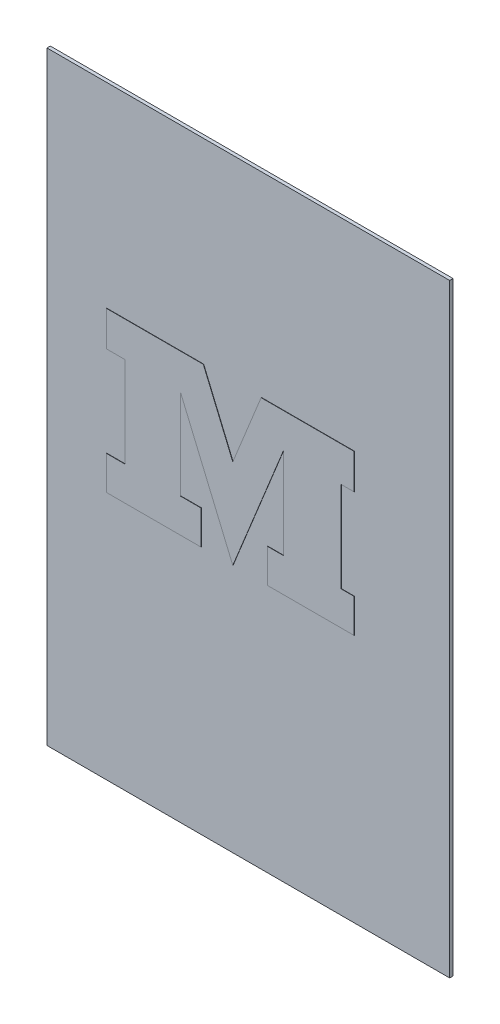
ISO-10303-21;
HEADER;
FILE_DESCRIPTION(('STEP AP214'),'2;1');
FILE_NAME('part.step','',(''),(''),'','','');
FILE_SCHEMA(('AUTOMOTIVE_DESIGN { 1 0 10303 214 1 1 1 1 }'));
ENDSEC;
DATA;
#1=APPLICATION_CONTEXT('core data for automotive mechanical design processes');
#2=APPLICATION_PROTOCOL_DEFINITION('international standard','automotive_design',2000,#1);
#3=PRODUCT_CONTEXT('',#1,'mechanical');
#4=PRODUCT('Part','Part','',(#3));
#5=PRODUCT_RELATED_PRODUCT_CATEGORY('part','',(#4));
#6=PRODUCT_DEFINITION_FORMATION('','',#4);
#7=PRODUCT_DEFINITION_CONTEXT('part definition',#1,'design');
#8=PRODUCT_DEFINITION('design','',#6,#7);
#9=PRODUCT_DEFINITION_SHAPE('','',#8);
#10=(LENGTH_UNIT() NAMED_UNIT(*) SI_UNIT(.MILLI.,.METRE.));
#11=(NAMED_UNIT(*) PLANE_ANGLE_UNIT() SI_UNIT($,.RADIAN.));
#12=(NAMED_UNIT(*) SI_UNIT($,.STERADIAN.) SOLID_ANGLE_UNIT());
#13=UNCERTAINTY_MEASURE_WITH_UNIT(LENGTH_MEASURE(1.E-05),#10,'distance_accuracy_value','');
#14=(GEOMETRIC_REPRESENTATION_CONTEXT(3) GLOBAL_UNCERTAINTY_ASSIGNED_CONTEXT((#13)) GLOBAL_UNIT_ASSIGNED_CONTEXT((#10,
#11,#12)) REPRESENTATION_CONTEXT('',''));
#15=CARTESIAN_POINT('',(0.,0.,0.));
#16=DIRECTION('',(0.,0.,1.));
#17=DIRECTION('',(1.,0.,0.));
#18=AXIS2_PLACEMENT_3D('',#15,#16,#17);
#19=CARTESIAN_POINT('',(0.,0.,2.54));
#20=DIRECTION('',(0.,0.,-1.));
#21=DIRECTION('',(-1.,0.,0.));
#22=AXIS2_PLACEMENT_3D('',#19,#20,#21);
#23=PLANE('',#22);
#24=DIRECTION('',(0.,-1.,0.));
#25=VECTOR('',#24,1.);
#26=CARTESIAN_POINT('',(0.,0.,2.54));
#27=LINE('',#26,#25);
#28=CARTESIAN_POINT('',(0.,457.2,2.54));
#29=VERTEX_POINT('',#28);
#30=CARTESIAN_POINT('',(0.,0.,2.54));
#31=VERTEX_POINT('',#30);
#32=EDGE_CURVE('E417',#29,#31,#27,.T.);
#33=ORIENTED_EDGE('',*,*,#32,.T.);
#34=DIRECTION('',(1.,0.,0.));
#35=VECTOR('',#34,1.);
#36=CARTESIAN_POINT('',(0.,0.,2.54));
#37=LINE('',#36,#35);
#38=CARTESIAN_POINT('',(304.8,0.,2.54));
#39=VERTEX_POINT('',#38);
#40=EDGE_CURVE('E420',#31,#39,#37,.T.);
#41=ORIENTED_EDGE('',*,*,#40,.T.);
#42=DIRECTION('',(0.,1.,0.));
#43=VECTOR('',#42,1.);
#44=CARTESIAN_POINT('',(304.8,0.,2.54));
#45=LINE('',#44,#43);
#46=CARTESIAN_POINT('',(304.8,457.2,2.54));
#47=VERTEX_POINT('',#46);
#48=EDGE_CURVE('E423',#39,#47,#45,.T.);
#49=ORIENTED_EDGE('',*,*,#48,.T.);
#50=DIRECTION('',(-1.,0.,0.));
#51=VECTOR('',#50,1.);
#52=CARTESIAN_POINT('',(0.,457.2,2.54));
#53=LINE('',#52,#51);
#54=EDGE_CURVE('E425',#47,#29,#53,.T.);
#55=ORIENTED_EDGE('',*,*,#54,.T.);
#56=EDGE_LOOP('',(#33,#41,#49,#55));
#57=FACE_BOUND('',#56,.T.);
#58=DIRECTION('',(1.,0.,0.));
#59=VECTOR('',#58,1.);
#60=CARTESIAN_POINT('',(76.5826407350404,188.599807008487,2.54));
#61=LINE('',#60,#59);
#62=CARTESIAN_POINT('',(45.2349092842466,188.599807008487,2.54));
#63=VERTEX_POINT('',#62);
#64=CARTESIAN_POINT('',(116.844272896433,188.599807008487,2.54));
#65=VERTEX_POINT('',#64);
#66=EDGE_CURVE('E233',#63,#65,#61,.T.);
#67=ORIENTED_EDGE('',*,*,#66,.F.);
#68=DIRECTION('',(0.,-1.,0.));
#69=VECTOR('',#68,1.);
#70=CARTESIAN_POINT('',(45.2349092842466,214.220845656646,2.54));
#71=LINE('',#70,#69);
#72=CARTESIAN_POINT('',(45.2349092842466,214.220845656646,2.54));
#73=VERTEX_POINT('',#72);
#74=EDGE_CURVE('E228',#73,#63,#71,.T.);
#75=ORIENTED_EDGE('',*,*,#74,.F.);
#76=DIRECTION('',(-1.,0.,0.));
#77=VECTOR('',#76,1.);
#78=CARTESIAN_POINT('',(59.1967625622006,214.220845656646,2.54));
#79=LINE('',#78,#77);
#80=CARTESIAN_POINT('',(59.1967625622006,214.220845656646,2.54));
#81=VERTEX_POINT('',#80);
#82=EDGE_CURVE('E347',#81,#73,#79,.T.);
#83=ORIENTED_EDGE('',*,*,#82,.F.);
#84=DIRECTION('',(0.,-1.,0.));
#85=VECTOR('',#84,1.);
#86=CARTESIAN_POINT('',(59.1967625622006,282.717908164988,2.54));
#87=LINE('',#86,#85);
#88=CARTESIAN_POINT('',(59.1967625622006,282.717908164988,2.54));
#89=VERTEX_POINT('',#88);
#90=EDGE_CURVE('E344',#89,#81,#87,.T.);
#91=ORIENTED_EDGE('',*,*,#90,.F.);
#92=DIRECTION('',(1.,0.,0.));
#93=VECTOR('',#92,1.);
#94=CARTESIAN_POINT('',(59.1967625622006,282.717908164988,2.54));
#95=LINE('',#94,#93);
#96=CARTESIAN_POINT('',(45.2349092842466,282.717908164988,2.54));
#97=VERTEX_POINT('',#96);
#98=EDGE_CURVE('E341',#97,#89,#95,.T.);
#99=ORIENTED_EDGE('',*,*,#98,.F.);
#100=DIRECTION('',(0.,-1.,0.));
#101=VECTOR('',#100,1.);
#102=CARTESIAN_POINT('',(45.2349092842466,282.717908164988,2.54));
#103=LINE('',#102,#101);
#104=CARTESIAN_POINT('',(45.2349092842466,309.271722910034,2.54));
#105=VERTEX_POINT('',#104);
#106=EDGE_CURVE('E338',#105,#97,#103,.T.);
#107=ORIENTED_EDGE('',*,*,#106,.F.);
#108=DIRECTION('',(-1.,0.,0.));
#109=VECTOR('',#108,1.);
#110=CARTESIAN_POINT('',(45.2349092842466,309.271722910034,2.54));
#111=LINE('',#110,#109);
#112=CARTESIAN_POINT('',(118.60662865246,309.271722910034,2.54));
#113=VERTEX_POINT('',#112);
#114=EDGE_CURVE('E335',#113,#105,#111,.T.);
#115=ORIENTED_EDGE('',*,*,#114,.F.);
#116=DIRECTION('',(-0.388972037040363,0.921249561411385,0.));
#117=VECTOR('',#116,1.);
#118=CARTESIAN_POINT('',(140.896676525317,256.479504263794,2.54));
#119=LINE('',#118,#117);
#120=CARTESIAN_POINT('',(140.896676525317,256.479504263794,2.54));
#121=VERTEX_POINT('',#120);
#122=EDGE_CURVE('E332',#121,#113,#119,.T.);
#123=ORIENTED_EDGE('',*,*,#122,.F.);
#124=DIRECTION('',(-0.37637704695592,-0.926466577122316,0.));
#125=VECTOR('',#124,1.);
#126=CARTESIAN_POINT('',(162.34351535035,309.271722910034,2.54));
#127=LINE('',#126,#125);
#128=CARTESIAN_POINT('',(162.34351535035,309.271722910034,2.54));
#129=VERTEX_POINT('',#128);
#130=EDGE_CURVE('E329',#129,#121,#127,.T.);
#131=ORIENTED_EDGE('',*,*,#130,.F.);
#132=DIRECTION('',(-1.,0.,0.));
#133=VECTOR('',#132,1.);
#134=CARTESIAN_POINT('',(222.900184239477,309.271722910034,2.54));
#135=LINE('',#134,#133);
#136=CARTESIAN_POINT('',(232.753082878553,309.271722910034,2.54));
#137=VERTEX_POINT('',#136);
#138=EDGE_CURVE('E326',#137,#129,#135,.T.);
#139=ORIENTED_EDGE('',*,*,#138,.F.);
#140=DIRECTION('',(0.,1.,0.));
#141=VECTOR('',#140,1.);
#142=CARTESIAN_POINT('',(232.753082878553,282.717908164988,2.54));
#143=LINE('',#142,#141);
#144=CARTESIAN_POINT('',(232.753082878553,282.717908164988,2.54));
#145=VERTEX_POINT('',#144);
#146=EDGE_CURVE('E323',#145,#137,#143,.T.);
#147=ORIENTED_EDGE('',*,*,#146,.F.);
#148=DIRECTION('',(1.,0.,0.));
#149=VECTOR('',#148,1.);
#150=CARTESIAN_POINT('',(222.900184239477,282.717908164988,2.54));
#151=LINE('',#150,#149);
#152=CARTESIAN_POINT('',(222.900184239477,282.717908164988,2.54));
#153=VERTEX_POINT('',#152);
#154=EDGE_CURVE('E320',#153,#145,#151,.T.);
#155=ORIENTED_EDGE('',*,*,#154,.F.);
#156=DIRECTION('',(0.,1.,0.));
#157=VECTOR('',#156,1.);
#158=CARTESIAN_POINT('',(222.900184239477,214.220845656646,2.54));
#159=LINE('',#158,#157);
#160=CARTESIAN_POINT('',(222.900184239477,214.220845656646,2.54));
#161=VERTEX_POINT('',#160);
#162=EDGE_CURVE('E317',#161,#153,#159,.T.);
#163=ORIENTED_EDGE('',*,*,#162,.F.);
#164=DIRECTION('',(-1.,0.,0.));
#165=VECTOR('',#164,1.);
#166=CARTESIAN_POINT('',(232.753082878553,214.220845656646,2.54));
#167=LINE('',#166,#165);
#168=CARTESIAN_POINT('',(232.753082878553,214.220845656646,2.54));
#169=VERTEX_POINT('',#168);
#170=EDGE_CURVE('E314',#169,#161,#167,.T.);
#171=ORIENTED_EDGE('',*,*,#170,.F.);
#172=DIRECTION('',(0.,1.,0.));
#173=VECTOR('',#172,1.);
#174=CARTESIAN_POINT('',(232.753082878553,188.599807008487,2.54));
#175=LINE('',#174,#173);
#176=CARTESIAN_POINT('',(232.753082878553,188.599807008487,2.54));
#177=VERTEX_POINT('',#176);
#178=EDGE_CURVE('E311',#177,#169,#175,.T.);
#179=ORIENTED_EDGE('',*,*,#178,.F.);
#180=DIRECTION('',(1.,0.,0.));
#181=VECTOR('',#180,1.);
#182=CARTESIAN_POINT('',(167.06709195138,188.599807008487,2.54));
#183=LINE('',#182,#181);
#184=CARTESIAN_POINT('',(167.06709195138,188.599807008487,2.54));
#185=VERTEX_POINT('',#184);
#186=EDGE_CURVE('E308',#185,#177,#183,.T.);
#187=ORIENTED_EDGE('',*,*,#186,.F.);
#188=DIRECTION('',(0.,-1.,0.));
#189=VECTOR('',#188,1.);
#190=CARTESIAN_POINT('',(167.06709195138,214.220845656646,2.54));
#191=LINE('',#190,#189);
#192=CARTESIAN_POINT('',(167.06709195138,214.220845656646,2.54));
#193=VERTEX_POINT('',#192);
#194=EDGE_CURVE('E305',#193,#185,#191,.T.);
#195=ORIENTED_EDGE('',*,*,#194,.F.);
#196=DIRECTION('',(-1.,0.,0.));
#197=VECTOR('',#196,1.);
#198=CARTESIAN_POINT('',(179.132155120143,214.220845656646,2.54));
#199=LINE('',#198,#197);
#200=CARTESIAN_POINT('',(179.132155120143,214.220845656646,2.54));
#201=VERTEX_POINT('',#200);
#202=EDGE_CURVE('E302',#201,#193,#199,.T.);
#203=ORIENTED_EDGE('',*,*,#202,.F.);
#204=DIRECTION('',(0.,-1.,0.));
#205=VECTOR('',#204,1.);
#206=CARTESIAN_POINT('',(179.132155120143,282.717908164988,2.54));
#207=LINE('',#206,#205);
#208=CARTESIAN_POINT('',(179.132155120143,282.717908164988,2.54));
#209=VERTEX_POINT('',#208);
#210=EDGE_CURVE('E299',#209,#201,#207,.T.);
#211=ORIENTED_EDGE('',*,*,#210,.F.);
#212=DIRECTION('',(0.37637704695592,0.926466577122316,0.));
#213=VECTOR('',#212,1.);
#214=CARTESIAN_POINT('',(140.896676525317,188.599807008487,2.54));
#215=LINE('',#214,#213);
#216=CARTESIAN_POINT('',(140.896676525317,188.599807008487,2.54));
#217=VERTEX_POINT('',#216);
#218=EDGE_CURVE('E296',#217,#209,#215,.T.);
#219=ORIENTED_EDGE('',*,*,#218,.F.);
#220=DIRECTION('',(0.388972037040363,-0.921249561411386,0.));
#221=VECTOR('',#220,1.);
#222=CARTESIAN_POINT('',(101.157922703682,282.717908164988,2.54));
#223=LINE('',#222,#221);
#224=CARTESIAN_POINT('',(101.157922703683,282.717908164988,2.54));
#225=VERTEX_POINT('',#224);
#226=EDGE_CURVE('E293',#225,#217,#223,.T.);
#227=ORIENTED_EDGE('',*,*,#226,.F.);
#228=DIRECTION('',(0.,1.,0.));
#229=VECTOR('',#228,1.);
#230=CARTESIAN_POINT('',(101.157922703682,214.220845656646,2.54));
#231=LINE('',#230,#229);
#232=CARTESIAN_POINT('',(101.157922703682,214.220845656646,2.54));
#233=VERTEX_POINT('',#232);
#234=EDGE_CURVE('E290',#233,#225,#231,.T.);
#235=ORIENTED_EDGE('',*,*,#234,.F.);
#236=DIRECTION('',(-1.,0.,0.));
#237=VECTOR('',#236,1.);
#238=CARTESIAN_POINT('',(116.844272896433,214.220845656646,2.54));
#239=LINE('',#238,#237);
#240=CARTESIAN_POINT('',(116.844272896433,214.220845656646,2.54));
#241=VERTEX_POINT('',#240);
#242=EDGE_CURVE('E55',#241,#233,#239,.T.);
#243=ORIENTED_EDGE('',*,*,#242,.F.);
#244=DIRECTION('',(0.,1.,0.));
#245=VECTOR('',#244,1.);
#246=CARTESIAN_POINT('',(116.844272896433,188.599807008487,2.54));
#247=LINE('',#246,#245);
#248=EDGE_CURVE('E50',#65,#241,#247,.T.);
#249=ORIENTED_EDGE('',*,*,#248,.F.);
#250=EDGE_LOOP('',(#67,#75,#83,#91,#99,#107,#115,#123,#131,#139,#147,#155,#163,#171,#179,#187,
#195,#203,#211,#219,#227,#235,#243,#249));
#251=FACE_BOUND('',#250,.T.);
#252=ADVANCED_FACE('F35',(#57,#251),#23,.F.);
#253=CARTESIAN_POINT('',(0.,0.,2.54));
#254=DIRECTION('',(1.,0.,0.));
#255=DIRECTION('',(0.,0.,-1.));
#256=AXIS2_PLACEMENT_3D('',#253,#254,#255);
#257=PLANE('',#256);
#258=DIRECTION('',(0.,-1.,0.));
#259=VECTOR('',#258,1.);
#260=CARTESIAN_POINT('',(0.,0.,0.));
#261=LINE('',#260,#259);
#262=CARTESIAN_POINT('',(0.,457.2,0.));
#263=VERTEX_POINT('',#262);
#264=CARTESIAN_POINT('',(0.,0.,0.));
#265=VERTEX_POINT('',#264);
#266=EDGE_CURVE('E235',#263,#265,#261,.T.);
#267=ORIENTED_EDGE('',*,*,#266,.T.);
#268=DIRECTION('',(0.,0.,-1.));
#269=VECTOR('',#268,1.);
#270=CARTESIAN_POINT('',(0.,0.,2.54));
#271=LINE('',#270,#269);
#272=EDGE_CURVE('E11',#31,#265,#271,.T.);
#273=ORIENTED_EDGE('',*,*,#272,.F.);
#274=ORIENTED_EDGE('',*,*,#32,.F.);
#275=DIRECTION('',(0.,0.,-1.));
#276=VECTOR('',#275,1.);
#277=CARTESIAN_POINT('',(0.,457.2,2.54));
#278=LINE('',#277,#276);
#279=EDGE_CURVE('E427',#29,#263,#278,.T.);
#280=ORIENTED_EDGE('',*,*,#279,.T.);
#281=EDGE_LOOP('',(#267,#273,#274,#280));
#282=FACE_BOUND('',#281,.T.);
#283=ADVANCED_FACE('F37',(#282),#257,.F.);
#284=CARTESIAN_POINT('',(0.,0.,2.54));
#285=DIRECTION('',(0.,1.,0.));
#286=DIRECTION('',(0.,0.,1.));
#287=AXIS2_PLACEMENT_3D('',#284,#285,#286);
#288=PLANE('',#287);
#289=DIRECTION('',(1.,0.,0.));
#290=VECTOR('',#289,1.);
#291=CARTESIAN_POINT('',(0.,0.,0.));
#292=LINE('',#291,#290);
#293=CARTESIAN_POINT('',(304.8,0.,0.));
#294=VERTEX_POINT('',#293);
#295=EDGE_CURVE('E430',#265,#294,#292,.T.);
#296=ORIENTED_EDGE('',*,*,#295,.T.);
#297=DIRECTION('',(0.,0.,-1.));
#298=VECTOR('',#297,1.);
#299=CARTESIAN_POINT('',(304.8,0.,2.54));
#300=LINE('',#299,#298);
#301=EDGE_CURVE('E43',#39,#294,#300,.T.);
#302=ORIENTED_EDGE('',*,*,#301,.F.);
#303=ORIENTED_EDGE('',*,*,#40,.F.);
#304=ORIENTED_EDGE('',*,*,#272,.T.);
#305=EDGE_LOOP('',(#296,#302,#303,#304));
#306=FACE_BOUND('',#305,.T.);
#307=ADVANCED_FACE('F459',(#306),#288,.F.);
#308=CARTESIAN_POINT('',(304.8,0.,2.54));
#309=DIRECTION('',(-1.,0.,0.));
#310=DIRECTION('',(0.,0.,1.));
#311=AXIS2_PLACEMENT_3D('',#308,#309,#310);
#312=PLANE('',#311);
#313=DIRECTION('',(0.,1.,0.));
#314=VECTOR('',#313,1.);
#315=CARTESIAN_POINT('',(304.8,0.,0.));
#316=LINE('',#315,#314);
#317=CARTESIAN_POINT('',(304.8,457.2,0.));
#318=VERTEX_POINT('',#317);
#319=EDGE_CURVE('E432',#294,#318,#316,.T.);
#320=ORIENTED_EDGE('',*,*,#319,.T.);
#321=DIRECTION('',(0.,0.,-1.));
#322=VECTOR('',#321,1.);
#323=CARTESIAN_POINT('',(304.8,457.2,2.54));
#324=LINE('',#323,#322);
#325=EDGE_CURVE('E437',#47,#318,#324,.T.);
#326=ORIENTED_EDGE('',*,*,#325,.F.);
#327=ORIENTED_EDGE('',*,*,#48,.F.);
#328=ORIENTED_EDGE('',*,*,#301,.T.);
#329=EDGE_LOOP('',(#320,#326,#327,#328));
#330=FACE_BOUND('',#329,.T.);
#331=ADVANCED_FACE('F444',(#330),#312,.F.);
#332=CARTESIAN_POINT('',(0.,457.2,2.54));
#333=DIRECTION('',(0.,-1.,0.));
#334=DIRECTION('',(0.,0.,-1.));
#335=AXIS2_PLACEMENT_3D('',#332,#333,#334);
#336=PLANE('',#335);
#337=DIRECTION('',(-1.,0.,0.));
#338=VECTOR('',#337,1.);
#339=CARTESIAN_POINT('',(0.,457.2,0.));
#340=LINE('',#339,#338);
#341=EDGE_CURVE('E421',#318,#263,#340,.T.);
#342=ORIENTED_EDGE('',*,*,#341,.T.);
#343=ORIENTED_EDGE('',*,*,#279,.F.);
#344=ORIENTED_EDGE('',*,*,#54,.F.);
#345=ORIENTED_EDGE('',*,*,#325,.T.);
#346=EDGE_LOOP('',(#342,#343,#344,#345));
#347=FACE_BOUND('',#346,.T.);
#348=ADVANCED_FACE('F453',(#347),#336,.F.);
#349=CARTESIAN_POINT('',(0.,0.,0.));
#350=DIRECTION('',(0.,0.,-1.));
#351=DIRECTION('',(-1.,0.,0.));
#352=AXIS2_PLACEMENT_3D('',#349,#350,#351);
#353=PLANE('',#352);
#354=ORIENTED_EDGE('',*,*,#266,.F.);
#355=ORIENTED_EDGE('',*,*,#341,.F.);
#356=ORIENTED_EDGE('',*,*,#319,.F.);
#357=ORIENTED_EDGE('',*,*,#295,.F.);
#358=EDGE_LOOP('',(#354,#355,#356,#357));
#359=FACE_BOUND('',#358,.T.);
#360=ADVANCED_FACE('F450',(#359),#353,.T.);
#361=CARTESIAN_POINT('',(76.5826407350404,188.599807008487,2.794));
#362=DIRECTION('',(0.,1.,0.));
#363=DIRECTION('',(0.,0.,1.));
#364=AXIS2_PLACEMENT_3D('',#361,#362,#363);
#365=PLANE('',#364);
#366=ORIENTED_EDGE('',*,*,#66,.T.);
#367=DIRECTION('',(0.,0.,-1.));
#368=VECTOR('',#367,1.);
#369=CARTESIAN_POINT('',(116.844272896433,188.599807008487,2.794));
#370=LINE('',#369,#368);
#371=CARTESIAN_POINT('',(116.844272896433,188.599807008487,2.794));
#372=VERTEX_POINT('',#371);
#373=EDGE_CURVE('E231',#372,#65,#370,.T.);
#374=ORIENTED_EDGE('',*,*,#373,.F.);
#375=DIRECTION('',(1.,0.,0.));
#376=VECTOR('',#375,1.);
#377=CARTESIAN_POINT('',(45.2349092842466,188.599807008487,2.794));
#378=LINE('',#377,#376);
#379=CARTESIAN_POINT('',(45.2349092842466,188.599807008487,2.794));
#380=VERTEX_POINT('',#379);
#381=EDGE_CURVE('E217',#380,#372,#378,.T.);
#382=ORIENTED_EDGE('',*,*,#381,.F.);
#383=DIRECTION('',(0.,0.,-1.));
#384=VECTOR('',#383,1.);
#385=CARTESIAN_POINT('',(45.2349092842466,188.599807008487,2.794));
#386=LINE('',#385,#384);
#387=EDGE_CURVE('E286',#380,#63,#386,.T.);
#388=ORIENTED_EDGE('',*,*,#387,.T.);
#389=EDGE_LOOP('',(#366,#374,#382,#388));
#390=FACE_BOUND('',#389,.T.);
#391=ADVANCED_FACE('F232',(#390),#365,.F.);
#392=CARTESIAN_POINT('',(116.844272896433,188.599807008487,2.794));
#393=DIRECTION('',(-1.,0.,0.));
#394=DIRECTION('',(0.,0.,1.));
#395=AXIS2_PLACEMENT_3D('',#392,#393,#394);
#396=PLANE('',#395);
#397=ORIENTED_EDGE('',*,*,#248,.T.);
#398=DIRECTION('',(0.,0.,-1.));
#399=VECTOR('',#398,1.);
#400=CARTESIAN_POINT('',(116.844272896433,214.220845656646,2.794));
#401=LINE('',#400,#399);
#402=CARTESIAN_POINT('',(116.844272896433,214.220845656646,2.794));
#403=VERTEX_POINT('',#402);
#404=EDGE_CURVE('E236',#403,#241,#401,.T.);
#405=ORIENTED_EDGE('',*,*,#404,.F.);
#406=DIRECTION('',(0.,1.,0.));
#407=VECTOR('',#406,1.);
#408=CARTESIAN_POINT('',(116.844272896433,188.599807008487,2.794));
#409=LINE('',#408,#407);
#410=EDGE_CURVE('E221',#372,#403,#409,.T.);
#411=ORIENTED_EDGE('',*,*,#410,.F.);
#412=ORIENTED_EDGE('',*,*,#373,.T.);
#413=EDGE_LOOP('',(#397,#405,#411,#412));
#414=FACE_BOUND('',#413,.T.);
#415=ADVANCED_FACE('F238',(#414),#396,.F.);
#416=CARTESIAN_POINT('',(116.844272896433,214.220845656646,2.794));
#417=DIRECTION('',(0.,-1.,0.));
#418=DIRECTION('',(0.,0.,-1.));
#419=AXIS2_PLACEMENT_3D('',#416,#417,#418);
#420=PLANE('',#419);
#421=ORIENTED_EDGE('',*,*,#242,.T.);
#422=DIRECTION('',(0.,0.,-1.));
#423=VECTOR('',#422,1.);
#424=CARTESIAN_POINT('',(101.157922703682,214.220845656646,2.794));
#425=LINE('',#424,#423);
#426=CARTESIAN_POINT('',(101.157922703682,214.220845656646,2.794));
#427=VERTEX_POINT('',#426);
#428=EDGE_CURVE('E413',#427,#233,#425,.T.);
#429=ORIENTED_EDGE('',*,*,#428,.F.);
#430=DIRECTION('',(-1.,0.,0.));
#431=VECTOR('',#430,1.);
#432=CARTESIAN_POINT('',(116.844272896433,214.220845656646,2.794));
#433=LINE('',#432,#431);
#434=EDGE_CURVE('E241',#403,#427,#433,.T.);
#435=ORIENTED_EDGE('',*,*,#434,.F.);
#436=ORIENTED_EDGE('',*,*,#404,.T.);
#437=EDGE_LOOP('',(#421,#429,#435,#436));
#438=FACE_BOUND('',#437,.T.);
#439=ADVANCED_FACE('F500',(#438),#420,.F.);
#440=CARTESIAN_POINT('',(101.157922703682,214.220845656646,2.794));
#441=DIRECTION('',(-1.,0.,0.));
#442=DIRECTION('',(0.,0.,1.));
#443=AXIS2_PLACEMENT_3D('',#440,#441,#442);
#444=PLANE('',#443);
#445=ORIENTED_EDGE('',*,*,#234,.T.);
#446=DIRECTION('',(0.,0.,-1.));
#447=VECTOR('',#446,1.);
#448=CARTESIAN_POINT('',(101.157922703682,282.717908164988,2.794));
#449=LINE('',#448,#447);
#450=CARTESIAN_POINT('',(101.157922703682,282.717908164988,2.794));
#451=VERTEX_POINT('',#450);
#452=EDGE_CURVE('E410',#451,#225,#449,.T.);
#453=ORIENTED_EDGE('',*,*,#452,.F.);
#454=DIRECTION('',(0.,1.,0.));
#455=VECTOR('',#454,1.);
#456=CARTESIAN_POINT('',(101.157922703682,214.220845656646,2.794));
#457=LINE('',#456,#455);
#458=EDGE_CURVE('E243',#427,#451,#457,.T.);
#459=ORIENTED_EDGE('',*,*,#458,.F.);
#460=ORIENTED_EDGE('',*,*,#428,.T.);
#461=EDGE_LOOP('',(#445,#453,#459,#460));
#462=FACE_BOUND('',#461,.T.);
#463=ADVANCED_FACE('F506',(#462),#444,.F.);
#464=CARTESIAN_POINT('',(101.157922703682,282.717908164988,2.794));
#465=DIRECTION('',(0.921249561411386,0.388972037040363,0.));
#466=DIRECTION('',(-0.388972037040363,0.921249561411386,0.));
#467=AXIS2_PLACEMENT_3D('',#464,#465,#466);
#468=PLANE('',#467);
#469=ORIENTED_EDGE('',*,*,#226,.T.);
#470=DIRECTION('',(0.,0.,-1.));
#471=VECTOR('',#470,1.);
#472=CARTESIAN_POINT('',(140.896676525317,188.599807008487,2.794));
#473=LINE('',#472,#471);
#474=CARTESIAN_POINT('',(140.896676525317,188.599807008487,2.794));
#475=VERTEX_POINT('',#474);
#476=EDGE_CURVE('E407',#475,#217,#473,.T.);
#477=ORIENTED_EDGE('',*,*,#476,.F.);
#478=DIRECTION('',(0.388972037040363,-0.921249561411386,0.));
#479=VECTOR('',#478,1.);
#480=CARTESIAN_POINT('',(101.157922703682,282.717908164988,2.794));
#481=LINE('',#480,#479);
#482=EDGE_CURVE('E247',#451,#475,#481,.T.);
#483=ORIENTED_EDGE('',*,*,#482,.F.);
#484=ORIENTED_EDGE('',*,*,#452,.T.);
#485=EDGE_LOOP('',(#469,#477,#483,#484));
#486=FACE_BOUND('',#485,.T.);
#487=ADVANCED_FACE('F514',(#486),#468,.F.);
#488=CARTESIAN_POINT('',(140.896676525317,188.599807008487,2.794));
#489=DIRECTION('',(-0.926466577122317,0.37637704695592,0.));
#490=DIRECTION('',(-0.37637704695592,-0.926466577122317,0.));
#491=AXIS2_PLACEMENT_3D('',#488,#489,#490);
#492=PLANE('',#491);
#493=ORIENTED_EDGE('',*,*,#218,.T.);
#494=DIRECTION('',(0.,0.,-1.));
#495=VECTOR('',#494,1.);
#496=CARTESIAN_POINT('',(179.132155120143,282.717908164988,2.794));
#497=LINE('',#496,#495);
#498=CARTESIAN_POINT('',(179.132155120143,282.717908164988,2.794));
#499=VERTEX_POINT('',#498);
#500=EDGE_CURVE('E404',#499,#209,#497,.T.);
#501=ORIENTED_EDGE('',*,*,#500,.F.);
#502=DIRECTION('',(0.37637704695592,0.926466577122316,0.));
#503=VECTOR('',#502,1.);
#504=CARTESIAN_POINT('',(140.896676525317,188.599807008487,2.794));
#505=LINE('',#504,#503);
#506=EDGE_CURVE('E249',#475,#499,#505,.T.);
#507=ORIENTED_EDGE('',*,*,#506,.F.);
#508=ORIENTED_EDGE('',*,*,#476,.T.);
#509=EDGE_LOOP('',(#493,#501,#507,#508));
#510=FACE_BOUND('',#509,.T.);
#511=ADVANCED_FACE('F522',(#510),#492,.F.);
#512=CARTESIAN_POINT('',(179.132155120143,282.717908164988,2.794));
#513=DIRECTION('',(1.,0.,0.));
#514=DIRECTION('',(0.,0.,-1.));
#515=AXIS2_PLACEMENT_3D('',#512,#513,#514);
#516=PLANE('',#515);
#517=ORIENTED_EDGE('',*,*,#210,.T.);
#518=DIRECTION('',(0.,0.,-1.));
#519=VECTOR('',#518,1.);
#520=CARTESIAN_POINT('',(179.132155120143,214.220845656646,2.794));
#521=LINE('',#520,#519);
#522=CARTESIAN_POINT('',(179.132155120143,214.220845656646,2.794));
#523=VERTEX_POINT('',#522);
#524=EDGE_CURVE('E401',#523,#201,#521,.T.);
#525=ORIENTED_EDGE('',*,*,#524,.F.);
#526=DIRECTION('',(0.,-1.,0.));
#527=VECTOR('',#526,1.);
#528=CARTESIAN_POINT('',(179.132155120143,282.717908164988,2.794));
#529=LINE('',#528,#527);
#530=EDGE_CURVE('E251',#499,#523,#529,.T.);
#531=ORIENTED_EDGE('',*,*,#530,.F.);
#532=ORIENTED_EDGE('',*,*,#500,.T.);
#533=EDGE_LOOP('',(#517,#525,#531,#532));
#534=FACE_BOUND('',#533,.T.);
#535=ADVANCED_FACE('F530',(#534),#516,.F.);
#536=CARTESIAN_POINT('',(179.132155120143,214.220845656646,2.794));
#537=DIRECTION('',(0.,-1.,0.));
#538=DIRECTION('',(0.,0.,-1.));
#539=AXIS2_PLACEMENT_3D('',#536,#537,#538);
#540=PLANE('',#539);
#541=ORIENTED_EDGE('',*,*,#202,.T.);
#542=DIRECTION('',(0.,0.,-1.));
#543=VECTOR('',#542,1.);
#544=CARTESIAN_POINT('',(167.06709195138,214.220845656646,2.794));
#545=LINE('',#544,#543);
#546=CARTESIAN_POINT('',(167.06709195138,214.220845656646,2.794));
#547=VERTEX_POINT('',#546);
#548=EDGE_CURVE('E398',#547,#193,#545,.T.);
#549=ORIENTED_EDGE('',*,*,#548,.F.);
#550=DIRECTION('',(-1.,0.,0.));
#551=VECTOR('',#550,1.);
#552=CARTESIAN_POINT('',(179.132155120143,214.220845656646,2.794));
#553=LINE('',#552,#551);
#554=EDGE_CURVE('E253',#523,#547,#553,.T.);
#555=ORIENTED_EDGE('',*,*,#554,.F.);
#556=ORIENTED_EDGE('',*,*,#524,.T.);
#557=EDGE_LOOP('',(#541,#549,#555,#556));
#558=FACE_BOUND('',#557,.T.);
#559=ADVANCED_FACE('F538',(#558),#540,.F.);
#560=CARTESIAN_POINT('',(167.06709195138,214.220845656646,2.794));
#561=DIRECTION('',(1.,0.,0.));
#562=DIRECTION('',(0.,0.,-1.));
#563=AXIS2_PLACEMENT_3D('',#560,#561,#562);
#564=PLANE('',#563);
#565=ORIENTED_EDGE('',*,*,#194,.T.);
#566=DIRECTION('',(0.,0.,-1.));
#567=VECTOR('',#566,1.);
#568=CARTESIAN_POINT('',(167.06709195138,188.599807008487,2.794));
#569=LINE('',#568,#567);
#570=CARTESIAN_POINT('',(167.06709195138,188.599807008487,2.794));
#571=VERTEX_POINT('',#570);
#572=EDGE_CURVE('E395',#571,#185,#569,.T.);
#573=ORIENTED_EDGE('',*,*,#572,.F.);
#574=DIRECTION('',(0.,-1.,0.));
#575=VECTOR('',#574,1.);
#576=CARTESIAN_POINT('',(167.06709195138,214.220845656646,2.794));
#577=LINE('',#576,#575);
#578=EDGE_CURVE('E255',#547,#571,#577,.T.);
#579=ORIENTED_EDGE('',*,*,#578,.F.);
#580=ORIENTED_EDGE('',*,*,#548,.T.);
#581=EDGE_LOOP('',(#565,#573,#579,#580));
#582=FACE_BOUND('',#581,.T.);
#583=ADVANCED_FACE('F546',(#582),#564,.F.);
#584=CARTESIAN_POINT('',(167.06709195138,188.599807008487,2.794));
#585=DIRECTION('',(0.,1.,0.));
#586=DIRECTION('',(0.,0.,1.));
#587=AXIS2_PLACEMENT_3D('',#584,#585,#586);
#588=PLANE('',#587);
#589=ORIENTED_EDGE('',*,*,#186,.T.);
#590=DIRECTION('',(0.,0.,-1.));
#591=VECTOR('',#590,1.);
#592=CARTESIAN_POINT('',(232.753082878553,188.599807008487,2.794));
#593=LINE('',#592,#591);
#594=CARTESIAN_POINT('',(232.753082878553,188.599807008487,2.794));
#595=VERTEX_POINT('',#594);
#596=EDGE_CURVE('E392',#595,#177,#593,.T.);
#597=ORIENTED_EDGE('',*,*,#596,.F.);
#598=DIRECTION('',(1.,0.,0.));
#599=VECTOR('',#598,1.);
#600=CARTESIAN_POINT('',(167.06709195138,188.599807008487,2.794));
#601=LINE('',#600,#599);
#602=EDGE_CURVE('E257',#571,#595,#601,.T.);
#603=ORIENTED_EDGE('',*,*,#602,.F.);
#604=ORIENTED_EDGE('',*,*,#572,.T.);
#605=EDGE_LOOP('',(#589,#597,#603,#604));
#606=FACE_BOUND('',#605,.T.);
#607=ADVANCED_FACE('F554',(#606),#588,.F.);
#608=CARTESIAN_POINT('',(232.753082878553,188.599807008487,2.794));
#609=DIRECTION('',(-1.,0.,0.));
#610=DIRECTION('',(0.,0.,1.));
#611=AXIS2_PLACEMENT_3D('',#608,#609,#610);
#612=PLANE('',#611);
#613=ORIENTED_EDGE('',*,*,#178,.T.);
#614=DIRECTION('',(0.,0.,-1.));
#615=VECTOR('',#614,1.);
#616=CARTESIAN_POINT('',(232.753082878553,214.220845656646,2.794));
#617=LINE('',#616,#615);
#618=CARTESIAN_POINT('',(232.753082878553,214.220845656646,2.794));
#619=VERTEX_POINT('',#618);
#620=EDGE_CURVE('E389',#619,#169,#617,.T.);
#621=ORIENTED_EDGE('',*,*,#620,.F.);
#622=DIRECTION('',(0.,1.,0.));
#623=VECTOR('',#622,1.);
#624=CARTESIAN_POINT('',(232.753082878553,188.599807008487,2.794));
#625=LINE('',#624,#623);
#626=EDGE_CURVE('E259',#595,#619,#625,.T.);
#627=ORIENTED_EDGE('',*,*,#626,.F.);
#628=ORIENTED_EDGE('',*,*,#596,.T.);
#629=EDGE_LOOP('',(#613,#621,#627,#628));
#630=FACE_BOUND('',#629,.T.);
#631=ADVANCED_FACE('F562',(#630),#612,.F.);
#632=CARTESIAN_POINT('',(232.753082878553,214.220845656646,2.794));
#633=DIRECTION('',(0.,-1.,0.));
#634=DIRECTION('',(0.,0.,-1.));
#635=AXIS2_PLACEMENT_3D('',#632,#633,#634);
#636=PLANE('',#635);
#637=ORIENTED_EDGE('',*,*,#170,.T.);
#638=DIRECTION('',(0.,0.,-1.));
#639=VECTOR('',#638,1.);
#640=CARTESIAN_POINT('',(222.900184239477,214.220845656646,2.794));
#641=LINE('',#640,#639);
#642=CARTESIAN_POINT('',(222.900184239477,214.220845656646,2.794));
#643=VERTEX_POINT('',#642);
#644=EDGE_CURVE('E386',#643,#161,#641,.T.);
#645=ORIENTED_EDGE('',*,*,#644,.F.);
#646=DIRECTION('',(-1.,0.,0.));
#647=VECTOR('',#646,1.);
#648=CARTESIAN_POINT('',(232.753082878553,214.220845656646,2.794));
#649=LINE('',#648,#647);
#650=EDGE_CURVE('E261',#619,#643,#649,.T.);
#651=ORIENTED_EDGE('',*,*,#650,.F.);
#652=ORIENTED_EDGE('',*,*,#620,.T.);
#653=EDGE_LOOP('',(#637,#645,#651,#652));
#654=FACE_BOUND('',#653,.T.);
#655=ADVANCED_FACE('F570',(#654),#636,.F.);
#656=CARTESIAN_POINT('',(222.900184239477,214.220845656646,2.794));
#657=DIRECTION('',(-1.,0.,0.));
#658=DIRECTION('',(0.,0.,1.));
#659=AXIS2_PLACEMENT_3D('',#656,#657,#658);
#660=PLANE('',#659);
#661=ORIENTED_EDGE('',*,*,#162,.T.);
#662=DIRECTION('',(0.,0.,-1.));
#663=VECTOR('',#662,1.);
#664=CARTESIAN_POINT('',(222.900184239477,282.717908164988,2.794));
#665=LINE('',#664,#663);
#666=CARTESIAN_POINT('',(222.900184239477,282.717908164988,2.794));
#667=VERTEX_POINT('',#666);
#668=EDGE_CURVE('E383',#667,#153,#665,.T.);
#669=ORIENTED_EDGE('',*,*,#668,.F.);
#670=DIRECTION('',(0.,1.,0.));
#671=VECTOR('',#670,1.);
#672=CARTESIAN_POINT('',(222.900184239477,214.220845656646,2.794));
#673=LINE('',#672,#671);
#674=EDGE_CURVE('E263',#643,#667,#673,.T.);
#675=ORIENTED_EDGE('',*,*,#674,.F.);
#676=ORIENTED_EDGE('',*,*,#644,.T.);
#677=EDGE_LOOP('',(#661,#669,#675,#676));
#678=FACE_BOUND('',#677,.T.);
#679=ADVANCED_FACE('F578',(#678),#660,.F.);
#680=CARTESIAN_POINT('',(222.900184239477,282.717908164988,2.794));
#681=DIRECTION('',(0.,1.,0.));
#682=DIRECTION('',(0.,0.,1.));
#683=AXIS2_PLACEMENT_3D('',#680,#681,#682);
#684=PLANE('',#683);
#685=ORIENTED_EDGE('',*,*,#154,.T.);
#686=DIRECTION('',(0.,0.,-1.));
#687=VECTOR('',#686,1.);
#688=CARTESIAN_POINT('',(232.753082878553,282.717908164988,2.794));
#689=LINE('',#688,#687);
#690=CARTESIAN_POINT('',(232.753082878553,282.717908164988,2.794));
#691=VERTEX_POINT('',#690);
#692=EDGE_CURVE('E380',#691,#145,#689,.T.);
#693=ORIENTED_EDGE('',*,*,#692,.F.);
#694=DIRECTION('',(1.,0.,0.));
#695=VECTOR('',#694,1.);
#696=CARTESIAN_POINT('',(222.900184239477,282.717908164988,2.794));
#697=LINE('',#696,#695);
#698=EDGE_CURVE('E265',#667,#691,#697,.T.);
#699=ORIENTED_EDGE('',*,*,#698,.F.);
#700=ORIENTED_EDGE('',*,*,#668,.T.);
#701=EDGE_LOOP('',(#685,#693,#699,#700));
#702=FACE_BOUND('',#701,.T.);
#703=ADVANCED_FACE('F586',(#702),#684,.F.);
#704=CARTESIAN_POINT('',(232.753082878553,282.717908164988,2.794));
#705=DIRECTION('',(-1.,0.,0.));
#706=DIRECTION('',(0.,0.,1.));
#707=AXIS2_PLACEMENT_3D('',#704,#705,#706);
#708=PLANE('',#707);
#709=ORIENTED_EDGE('',*,*,#146,.T.);
#710=DIRECTION('',(0.,0.,-1.));
#711=VECTOR('',#710,1.);
#712=CARTESIAN_POINT('',(232.753082878553,309.271722910034,2.794));
#713=LINE('',#712,#711);
#714=CARTESIAN_POINT('',(232.753082878553,309.271722910034,2.794));
#715=VERTEX_POINT('',#714);
#716=EDGE_CURVE('E377',#715,#137,#713,.T.);
#717=ORIENTED_EDGE('',*,*,#716,.F.);
#718=DIRECTION('',(0.,1.,0.));
#719=VECTOR('',#718,1.);
#720=CARTESIAN_POINT('',(232.753082878553,282.717908164988,2.794));
#721=LINE('',#720,#719);
#722=EDGE_CURVE('E267',#691,#715,#721,.T.);
#723=ORIENTED_EDGE('',*,*,#722,.F.);
#724=ORIENTED_EDGE('',*,*,#692,.T.);
#725=EDGE_LOOP('',(#709,#717,#723,#724));
#726=FACE_BOUND('',#725,.T.);
#727=ADVANCED_FACE('F594',(#726),#708,.F.);
#728=CARTESIAN_POINT('',(222.900184239477,309.271722910034,2.794));
#729=DIRECTION('',(0.,-1.,0.));
#730=DIRECTION('',(0.,0.,-1.));
#731=AXIS2_PLACEMENT_3D('',#728,#729,#730);
#732=PLANE('',#731);
#733=ORIENTED_EDGE('',*,*,#138,.T.);
#734=DIRECTION('',(0.,0.,-1.));
#735=VECTOR('',#734,1.);
#736=CARTESIAN_POINT('',(162.34351535035,309.271722910034,2.794));
#737=LINE('',#736,#735);
#738=CARTESIAN_POINT('',(162.34351535035,309.271722910034,2.794));
#739=VERTEX_POINT('',#738);
#740=EDGE_CURVE('E374',#739,#129,#737,.T.);
#741=ORIENTED_EDGE('',*,*,#740,.F.);
#742=DIRECTION('',(-1.,0.,0.));
#743=VECTOR('',#742,1.);
#744=CARTESIAN_POINT('',(232.753082878553,309.271722910034,2.794));
#745=LINE('',#744,#743);
#746=EDGE_CURVE('E269',#715,#739,#745,.T.);
#747=ORIENTED_EDGE('',*,*,#746,.F.);
#748=ORIENTED_EDGE('',*,*,#716,.T.);
#749=EDGE_LOOP('',(#733,#741,#747,#748));
#750=FACE_BOUND('',#749,.T.);
#751=ADVANCED_FACE('F602',(#750),#732,.F.);
#752=CARTESIAN_POINT('',(162.34351535035,309.271722910034,2.794));
#753=DIRECTION('',(0.926466577122316,-0.37637704695592,0.));
#754=DIRECTION('',(0.37637704695592,0.926466577122317,0.));
#755=AXIS2_PLACEMENT_3D('',#752,#753,#754);
#756=PLANE('',#755);
#757=ORIENTED_EDGE('',*,*,#130,.T.);
#758=DIRECTION('',(0.,0.,-1.));
#759=VECTOR('',#758,1.);
#760=CARTESIAN_POINT('',(140.896676525317,256.479504263794,2.794));
#761=LINE('',#760,#759);
#762=CARTESIAN_POINT('',(140.896676525317,256.479504263794,2.794));
#763=VERTEX_POINT('',#762);
#764=EDGE_CURVE('E371',#763,#121,#761,.T.);
#765=ORIENTED_EDGE('',*,*,#764,.F.);
#766=DIRECTION('',(-0.37637704695592,-0.926466577122316,0.));
#767=VECTOR('',#766,1.);
#768=CARTESIAN_POINT('',(162.34351535035,309.271722910034,2.794));
#769=LINE('',#768,#767);
#770=EDGE_CURVE('E271',#739,#763,#769,.T.);
#771=ORIENTED_EDGE('',*,*,#770,.F.);
#772=ORIENTED_EDGE('',*,*,#740,.T.);
#773=EDGE_LOOP('',(#757,#765,#771,#772));
#774=FACE_BOUND('',#773,.T.);
#775=ADVANCED_FACE('F610',(#774),#756,.F.);
#776=CARTESIAN_POINT('',(140.896676525317,256.479504263794,2.794));
#777=DIRECTION('',(-0.921249561411386,-0.388972037040363,0.));
#778=DIRECTION('',(0.388972037040363,-0.921249561411385,0.));
#779=AXIS2_PLACEMENT_3D('',#776,#777,#778);
#780=PLANE('',#779);
#781=ORIENTED_EDGE('',*,*,#122,.T.);
#782=DIRECTION('',(0.,0.,-1.));
#783=VECTOR('',#782,1.);
#784=CARTESIAN_POINT('',(118.60662865246,309.271722910034,2.794));
#785=LINE('',#784,#783);
#786=CARTESIAN_POINT('',(118.60662865246,309.271722910034,2.794));
#787=VERTEX_POINT('',#786);
#788=EDGE_CURVE('E368',#787,#113,#785,.T.);
#789=ORIENTED_EDGE('',*,*,#788,.F.);
#790=DIRECTION('',(-0.388972037040363,0.921249561411385,0.));
#791=VECTOR('',#790,1.);
#792=CARTESIAN_POINT('',(140.896676525317,256.479504263794,2.794));
#793=LINE('',#792,#791);
#794=EDGE_CURVE('E273',#763,#787,#793,.T.);
#795=ORIENTED_EDGE('',*,*,#794,.F.);
#796=ORIENTED_EDGE('',*,*,#764,.T.);
#797=EDGE_LOOP('',(#781,#789,#795,#796));
#798=FACE_BOUND('',#797,.T.);
#799=ADVANCED_FACE('F618',(#798),#780,.F.);
#800=CARTESIAN_POINT('',(45.2349092842466,309.271722910034,2.794));
#801=DIRECTION('',(0.,-1.,0.));
#802=DIRECTION('',(0.,0.,-1.));
#803=AXIS2_PLACEMENT_3D('',#800,#801,#802);
#804=PLANE('',#803);
#805=ORIENTED_EDGE('',*,*,#114,.T.);
#806=DIRECTION('',(0.,0.,-1.));
#807=VECTOR('',#806,1.);
#808=CARTESIAN_POINT('',(45.2349092842466,309.271722910034,2.794));
#809=LINE('',#808,#807);
#810=CARTESIAN_POINT('',(45.2349092842466,309.271722910034,2.794));
#811=VERTEX_POINT('',#810);
#812=EDGE_CURVE('E365',#811,#105,#809,.T.);
#813=ORIENTED_EDGE('',*,*,#812,.F.);
#814=DIRECTION('',(-1.,0.,0.));
#815=VECTOR('',#814,1.);
#816=CARTESIAN_POINT('',(118.60662865246,309.271722910034,2.794));
#817=LINE('',#816,#815);
#818=EDGE_CURVE('E275',#787,#811,#817,.T.);
#819=ORIENTED_EDGE('',*,*,#818,.F.);
#820=ORIENTED_EDGE('',*,*,#788,.T.);
#821=EDGE_LOOP('',(#805,#813,#819,#820));
#822=FACE_BOUND('',#821,.T.);
#823=ADVANCED_FACE('F626',(#822),#804,.F.);
#824=CARTESIAN_POINT('',(45.2349092842466,282.717908164988,2.794));
#825=DIRECTION('',(1.,0.,0.));
#826=DIRECTION('',(0.,0.,-1.));
#827=AXIS2_PLACEMENT_3D('',#824,#825,#826);
#828=PLANE('',#827);
#829=ORIENTED_EDGE('',*,*,#106,.T.);
#830=DIRECTION('',(0.,0.,-1.));
#831=VECTOR('',#830,1.);
#832=CARTESIAN_POINT('',(45.2349092842466,282.717908164988,2.794));
#833=LINE('',#832,#831);
#834=CARTESIAN_POINT('',(45.2349092842466,282.717908164988,2.794));
#835=VERTEX_POINT('',#834);
#836=EDGE_CURVE('E362',#835,#97,#833,.T.);
#837=ORIENTED_EDGE('',*,*,#836,.F.);
#838=DIRECTION('',(0.,-1.,0.));
#839=VECTOR('',#838,1.);
#840=CARTESIAN_POINT('',(45.2349092842466,282.717908164988,2.794));
#841=LINE('',#840,#839);
#842=EDGE_CURVE('E277',#811,#835,#841,.T.);
#843=ORIENTED_EDGE('',*,*,#842,.F.);
#844=ORIENTED_EDGE('',*,*,#812,.T.);
#845=EDGE_LOOP('',(#829,#837,#843,#844));
#846=FACE_BOUND('',#845,.T.);
#847=ADVANCED_FACE('F634',(#846),#828,.F.);
#848=CARTESIAN_POINT('',(59.1967625622006,282.717908164988,2.794));
#849=DIRECTION('',(0.,1.,0.));
#850=DIRECTION('',(0.,0.,1.));
#851=AXIS2_PLACEMENT_3D('',#848,#849,#850);
#852=PLANE('',#851);
#853=ORIENTED_EDGE('',*,*,#98,.T.);
#854=DIRECTION('',(0.,0.,-1.));
#855=VECTOR('',#854,1.);
#856=CARTESIAN_POINT('',(59.1967625622006,282.717908164988,2.794));
#857=LINE('',#856,#855);
#858=CARTESIAN_POINT('',(59.1967625622006,282.717908164988,2.794));
#859=VERTEX_POINT('',#858);
#860=EDGE_CURVE('E359',#859,#89,#857,.T.);
#861=ORIENTED_EDGE('',*,*,#860,.F.);
#862=DIRECTION('',(1.,0.,0.));
#863=VECTOR('',#862,1.);
#864=CARTESIAN_POINT('',(59.1967625622006,282.717908164988,2.794));
#865=LINE('',#864,#863);
#866=EDGE_CURVE('E279',#835,#859,#865,.T.);
#867=ORIENTED_EDGE('',*,*,#866,.F.);
#868=ORIENTED_EDGE('',*,*,#836,.T.);
#869=EDGE_LOOP('',(#853,#861,#867,#868));
#870=FACE_BOUND('',#869,.T.);
#871=ADVANCED_FACE('F642',(#870),#852,.F.);
#872=CARTESIAN_POINT('',(59.1967625622006,282.717908164988,2.794));
#873=DIRECTION('',(1.,0.,0.));
#874=DIRECTION('',(0.,0.,-1.));
#875=AXIS2_PLACEMENT_3D('',#872,#873,#874);
#876=PLANE('',#875);
#877=ORIENTED_EDGE('',*,*,#90,.T.);
#878=DIRECTION('',(0.,0.,-1.));
#879=VECTOR('',#878,1.);
#880=CARTESIAN_POINT('',(59.1967625622006,214.220845656646,2.794));
#881=LINE('',#880,#879);
#882=CARTESIAN_POINT('',(59.1967625622006,214.220845656646,2.794));
#883=VERTEX_POINT('',#882);
#884=EDGE_CURVE('E356',#883,#81,#881,.T.);
#885=ORIENTED_EDGE('',*,*,#884,.F.);
#886=DIRECTION('',(0.,-1.,0.));
#887=VECTOR('',#886,1.);
#888=CARTESIAN_POINT('',(59.1967625622006,282.717908164988,2.794));
#889=LINE('',#888,#887);
#890=EDGE_CURVE('E281',#859,#883,#889,.T.);
#891=ORIENTED_EDGE('',*,*,#890,.F.);
#892=ORIENTED_EDGE('',*,*,#860,.T.);
#893=EDGE_LOOP('',(#877,#885,#891,#892));
#894=FACE_BOUND('',#893,.T.);
#895=ADVANCED_FACE('F650',(#894),#876,.F.);
#896=CARTESIAN_POINT('',(59.1967625622006,214.220845656646,2.794));
#897=DIRECTION('',(0.,-1.,0.));
#898=DIRECTION('',(0.,0.,-1.));
#899=AXIS2_PLACEMENT_3D('',#896,#897,#898);
#900=PLANE('',#899);
#901=ORIENTED_EDGE('',*,*,#82,.T.);
#902=DIRECTION('',(0.,0.,-1.));
#903=VECTOR('',#902,1.);
#904=CARTESIAN_POINT('',(45.2349092842466,214.220845656646,2.794));
#905=LINE('',#904,#903);
#906=CARTESIAN_POINT('',(45.2349092842466,214.220845656646,2.794));
#907=VERTEX_POINT('',#906);
#908=EDGE_CURVE('E353',#907,#73,#905,.T.);
#909=ORIENTED_EDGE('',*,*,#908,.F.);
#910=DIRECTION('',(-1.,0.,0.));
#911=VECTOR('',#910,1.);
#912=CARTESIAN_POINT('',(59.1967625622006,214.220845656646,2.794));
#913=LINE('',#912,#911);
#914=EDGE_CURVE('E283',#883,#907,#913,.T.);
#915=ORIENTED_EDGE('',*,*,#914,.F.);
#916=ORIENTED_EDGE('',*,*,#884,.T.);
#917=EDGE_LOOP('',(#901,#909,#915,#916));
#918=FACE_BOUND('',#917,.T.);
#919=ADVANCED_FACE('F658',(#918),#900,.F.);
#920=CARTESIAN_POINT('',(45.2349092842466,214.220845656646,2.794));
#921=DIRECTION('',(1.,0.,0.));
#922=DIRECTION('',(0.,0.,-1.));
#923=AXIS2_PLACEMENT_3D('',#920,#921,#922);
#924=PLANE('',#923);
#925=ORIENTED_EDGE('',*,*,#74,.T.);
#926=ORIENTED_EDGE('',*,*,#387,.F.);
#927=DIRECTION('',(0.,-1.,0.));
#928=VECTOR('',#927,1.);
#929=CARTESIAN_POINT('',(45.2349092842466,214.220845656646,2.794));
#930=LINE('',#929,#928);
#931=EDGE_CURVE('E224',#907,#380,#930,.T.);
#932=ORIENTED_EDGE('',*,*,#931,.F.);
#933=ORIENTED_EDGE('',*,*,#908,.T.);
#934=EDGE_LOOP('',(#925,#926,#932,#933));
#935=FACE_BOUND('',#934,.T.);
#936=ADVANCED_FACE('F666',(#935),#924,.F.);
#937=CARTESIAN_POINT('',(0.,0.,2.794));
#938=DIRECTION('',(0.,0.,1.));
#939=DIRECTION('',(1.,0.,0.));
#940=AXIS2_PLACEMENT_3D('',#937,#938,#939);
#941=PLANE('',#940);
#942=ORIENTED_EDGE('',*,*,#381,.T.);
#943=ORIENTED_EDGE('',*,*,#410,.T.);
#944=ORIENTED_EDGE('',*,*,#434,.T.);
#945=ORIENTED_EDGE('',*,*,#458,.T.);
#946=ORIENTED_EDGE('',*,*,#482,.T.);
#947=ORIENTED_EDGE('',*,*,#506,.T.);
#948=ORIENTED_EDGE('',*,*,#530,.T.);
#949=ORIENTED_EDGE('',*,*,#554,.T.);
#950=ORIENTED_EDGE('',*,*,#578,.T.);
#951=ORIENTED_EDGE('',*,*,#602,.T.);
#952=ORIENTED_EDGE('',*,*,#626,.T.);
#953=ORIENTED_EDGE('',*,*,#650,.T.);
#954=ORIENTED_EDGE('',*,*,#674,.T.);
#955=ORIENTED_EDGE('',*,*,#698,.T.);
#956=ORIENTED_EDGE('',*,*,#722,.T.);
#957=ORIENTED_EDGE('',*,*,#746,.T.);
#958=ORIENTED_EDGE('',*,*,#770,.T.);
#959=ORIENTED_EDGE('',*,*,#794,.T.);
#960=ORIENTED_EDGE('',*,*,#818,.T.);
#961=ORIENTED_EDGE('',*,*,#842,.T.);
#962=ORIENTED_EDGE('',*,*,#866,.T.);
#963=ORIENTED_EDGE('',*,*,#890,.T.);
#964=ORIENTED_EDGE('',*,*,#914,.T.);
#965=ORIENTED_EDGE('',*,*,#931,.T.);
#966=EDGE_LOOP('',(#942,#943,#944,#945,#946,#947,#948,#949,#950,#951,#952,#953,#954,#955,#956,
#957,#958,#959,#960,#961,#962,#963,#964,#965));
#967=FACE_BOUND('',#966,.T.);
#968=ADVANCED_FACE('F219',(#967),#941,.T.);
#969=CLOSED_SHELL('',(#252,#283,#307,#331,#348,#360,#391,#415,#439,#463,#487,#511,#535,#559,
#583,#607,#631,#655,#679,#703,#727,#751,#775,#799,#823,#847,#871,#895,#919,#936,#968));
#970=MANIFOLD_SOLID_BREP('B2',#969);
#971=ADVANCED_BREP_SHAPE_REPRESENTATION('',(#18,#970),#14);
#972=SHAPE_DEFINITION_REPRESENTATION(#9,#971);
ENDSEC;
END-ISO-10303-21;
